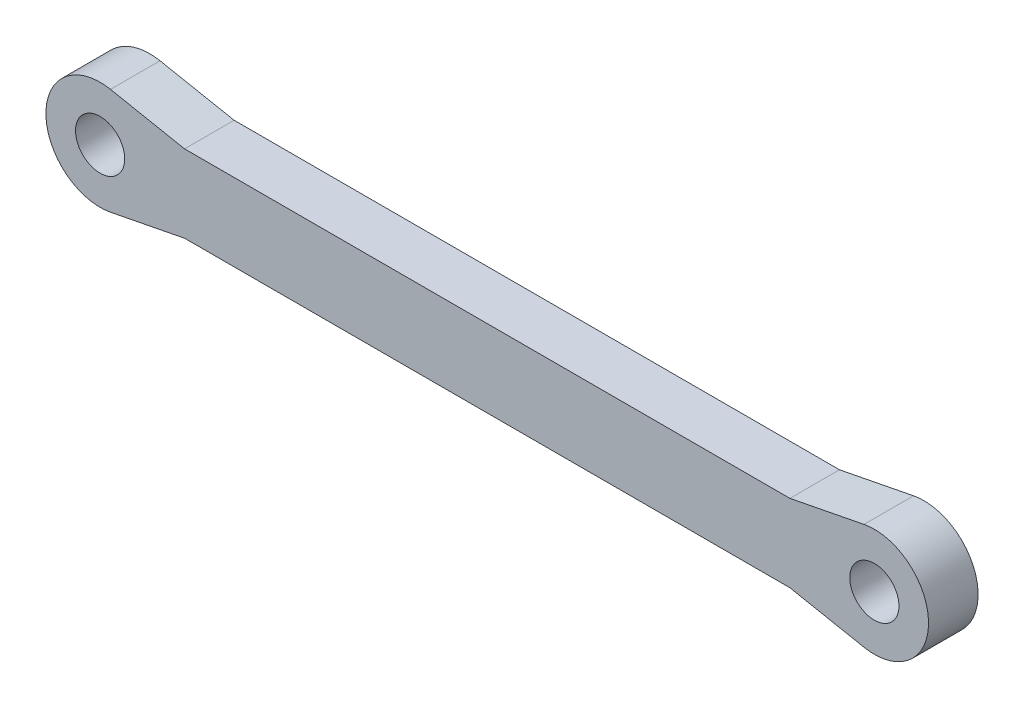
ISO-10303-21;
HEADER;
FILE_DESCRIPTION(('STEP AP214'),'2;1');
FILE_NAME('part.step','',(''),(''),'','','');
FILE_SCHEMA(('AUTOMOTIVE_DESIGN { 1 0 10303 214 1 1 1 1 }'));
ENDSEC;
DATA;
#1=APPLICATION_CONTEXT('core data for automotive mechanical design processes');
#2=APPLICATION_PROTOCOL_DEFINITION('international standard','automotive_design',2000,#1);
#3=PRODUCT_CONTEXT('',#1,'mechanical');
#4=PRODUCT('Part','Part','',(#3));
#5=PRODUCT_RELATED_PRODUCT_CATEGORY('part','',(#4));
#6=PRODUCT_DEFINITION_FORMATION('','',#4);
#7=PRODUCT_DEFINITION_CONTEXT('part definition',#1,'design');
#8=PRODUCT_DEFINITION('design','',#6,#7);
#9=PRODUCT_DEFINITION_SHAPE('','',#8);
#10=(LENGTH_UNIT() NAMED_UNIT(*) SI_UNIT(.MILLI.,.METRE.));
#11=(NAMED_UNIT(*) PLANE_ANGLE_UNIT() SI_UNIT($,.RADIAN.));
#12=(NAMED_UNIT(*) SI_UNIT($,.STERADIAN.) SOLID_ANGLE_UNIT());
#13=UNCERTAINTY_MEASURE_WITH_UNIT(LENGTH_MEASURE(1.E-05),#10,'distance_accuracy_value','');
#14=(GEOMETRIC_REPRESENTATION_CONTEXT(3) GLOBAL_UNCERTAINTY_ASSIGNED_CONTEXT((#13)) GLOBAL_UNIT_ASSIGNED_CONTEXT((#10,
#11,#12)) REPRESENTATION_CONTEXT('',''));
#15=CARTESIAN_POINT('',(0.,0.,0.));
#16=DIRECTION('',(0.,0.,1.));
#17=DIRECTION('',(1.,0.,0.));
#18=AXIS2_PLACEMENT_3D('',#15,#16,#17);
#19=CARTESIAN_POINT('',(24.9999999999999,2.22044604925031E-13,1.6));
#20=DIRECTION('',(0.,0.,1.));
#21=DIRECTION('',(1.,0.,0.));
#22=AXIS2_PLACEMENT_3D('',#19,#20,#21);
#23=PLANE('',#22);
#24=CARTESIAN_POINT('',(-25.0000000000001,2.22044604925031E-13,1.6));
#25=DIRECTION('',(0.,0.,1.));
#26=DIRECTION('',(1.,0.,0.));
#27=AXIS2_PLACEMENT_3D('',#24,#25,#26);
#28=CIRCLE('',#27,1.58750000000008);
#29=CARTESIAN_POINT('',(-23.4125000000001,2.22044604925031E-13,1.6));
#30=VERTEX_POINT('',#29);
#31=EDGE_CURVE('E134',#30,#30,#28,.T.);
#32=ORIENTED_EDGE('',*,*,#31,.F.);
#33=EDGE_LOOP('',(#32));
#34=FACE_BOUND('',#33,.T.);
#35=DIRECTION('',(0.981423427417235,-0.191854257488876,0.));
#36=VECTOR('',#35,1.);
#37=CARTESIAN_POINT('',(19.5456439426829,-2.49999999999995,1.6));
#38=LINE('',#37,#36);
#39=CARTESIAN_POINT('',(19.5456439426829,-2.49999999999995,1.6));
#40=VERTEX_POINT('',#39);
#41=CARTESIAN_POINT('',(24.3285100987898,-3.43498199596002,1.6));
#42=VERTEX_POINT('',#41);
#43=EDGE_CURVE('E145',#40,#42,#38,.T.);
#44=ORIENTED_EDGE('',*,*,#43,.T.);
#45=CARTESIAN_POINT('',(24.9999999999999,2.22044604925031E-13,1.6));
#46=DIRECTION('',(0.,0.,1.));
#47=DIRECTION('',(1.,0.,0.));
#48=AXIS2_PLACEMENT_3D('',#45,#46,#47);
#49=CIRCLE('',#48,3.49999999999974);
#50=CARTESIAN_POINT('',(24.3285100987889,3.43498199596026,1.6));
#51=VERTEX_POINT('',#50);
#52=EDGE_CURVE('E93',#42,#51,#49,.T.);
#53=ORIENTED_EDGE('',*,*,#52,.T.);
#54=DIRECTION('',(-0.981423427417235,-0.191854257488876,0.));
#55=VECTOR('',#54,1.);
#56=CARTESIAN_POINT('',(19.545643942682,2.50000000000017,1.6));
#57=LINE('',#56,#55);
#58=CARTESIAN_POINT('',(19.545643942682,2.50000000000017,1.6));
#59=VERTEX_POINT('',#58);
#60=EDGE_CURVE('E160',#51,#59,#57,.T.);
#61=ORIENTED_EDGE('',*,*,#60,.T.);
#62=DIRECTION('',(-1.,0.,0.));
#63=VECTOR('',#62,1.);
#64=CARTESIAN_POINT('',(19.545643942682,2.50000000000017,1.6));
#65=LINE('',#64,#63);
#66=CARTESIAN_POINT('',(-19.545643942682,2.50000000000017,1.6));
#67=VERTEX_POINT('',#66);
#68=EDGE_CURVE('E173',#59,#67,#65,.T.);
#69=ORIENTED_EDGE('',*,*,#68,.T.);
#70=DIRECTION('',(-0.981423427417252,0.191854257488788,0.));
#71=VECTOR('',#70,1.);
#72=CARTESIAN_POINT('',(-19.545643942682,2.50000000000017,1.6));
#73=LINE('',#72,#71);
#74=CARTESIAN_POINT('',(-24.3285100987888,3.43498199596012,1.6));
#75=VERTEX_POINT('',#74);
#76=EDGE_CURVE('E112',#67,#75,#73,.T.);
#77=ORIENTED_EDGE('',*,*,#76,.T.);
#78=CARTESIAN_POINT('',(-25.0000000000001,2.22044604925031E-13,1.6));
#79=DIRECTION('',(0.,0.,1.));
#80=DIRECTION('',(1.,0.,0.));
#81=AXIS2_PLACEMENT_3D('',#78,#79,#80);
#82=CIRCLE('',#81,3.49999999999963);
#83=CARTESIAN_POINT('',(-24.3285100987891,-3.43498199596004,1.6));
#84=VERTEX_POINT('',#83);
#85=EDGE_CURVE('E106',#75,#84,#82,.T.);
#86=ORIENTED_EDGE('',*,*,#85,.T.);
#87=DIRECTION('',(0.98142342741723,0.191854257488901,0.));
#88=VECTOR('',#87,1.);
#89=CARTESIAN_POINT('',(-19.5456439426829,-2.49999999999995,1.6));
#90=LINE('',#89,#88);
#91=CARTESIAN_POINT('',(-19.5456439426829,-2.49999999999995,1.6));
#92=VERTEX_POINT('',#91);
#93=EDGE_CURVE('E110',#84,#92,#90,.T.);
#94=ORIENTED_EDGE('',*,*,#93,.T.);
#95=DIRECTION('',(1.,0.,0.));
#96=VECTOR('',#95,1.);
#97=CARTESIAN_POINT('',(19.5456439426829,-2.49999999999995,1.6));
#98=LINE('',#97,#96);
#99=EDGE_CURVE('E50',#92,#40,#98,.T.);
#100=ORIENTED_EDGE('',*,*,#99,.T.);
#101=EDGE_LOOP('',(#44,#53,#61,#69,#77,#86,#94,#100));
#102=FACE_BOUND('',#101,.T.);
#103=CARTESIAN_POINT('',(24.9999999999999,2.22044604925031E-13,1.6));
#104=DIRECTION('',(0.,0.,1.));
#105=DIRECTION('',(1.,0.,0.));
#106=AXIS2_PLACEMENT_3D('',#103,#104,#105);
#107=CIRCLE('',#106,1.58750000000008);
#108=CARTESIAN_POINT('',(26.5875,2.22044604925031E-13,1.6));
#109=VERTEX_POINT('',#108);
#110=EDGE_CURVE('E182',#109,#109,#107,.T.);
#111=ORIENTED_EDGE('',*,*,#110,.F.);
#112=EDGE_LOOP('',(#111));
#113=FACE_BOUND('',#112,.T.);
#114=ADVANCED_FACE('F33',(#34,#102,#113),#23,.T.);
#115=CARTESIAN_POINT('',(24.9999999999999,2.22044604925031E-13,-1.6));
#116=DIRECTION('',(0.,0.,1.));
#117=DIRECTION('',(1.,0.,0.));
#118=AXIS2_PLACEMENT_3D('',#115,#116,#117);
#119=PLANE('',#118);
#120=DIRECTION('',(0.981423427417235,-0.191854257488876,0.));
#121=VECTOR('',#120,1.);
#122=CARTESIAN_POINT('',(19.5456439426829,-2.49999999999995,-1.6));
#123=LINE('',#122,#121);
#124=CARTESIAN_POINT('',(19.5456439426829,-2.49999999999995,-1.6));
#125=VERTEX_POINT('',#124);
#126=CARTESIAN_POINT('',(24.3285100987898,-3.43498199596002,-1.6));
#127=VERTEX_POINT('',#126);
#128=EDGE_CURVE('E130',#125,#127,#123,.T.);
#129=ORIENTED_EDGE('',*,*,#128,.F.);
#130=DIRECTION('',(1.,0.,0.));
#131=VECTOR('',#130,1.);
#132=CARTESIAN_POINT('',(19.5456439426829,-2.49999999999995,-1.6));
#133=LINE('',#132,#131);
#134=CARTESIAN_POINT('',(-19.5456439426829,-2.49999999999995,-1.6));
#135=VERTEX_POINT('',#134);
#136=EDGE_CURVE('E85',#135,#125,#133,.T.);
#137=ORIENTED_EDGE('',*,*,#136,.F.);
#138=DIRECTION('',(0.98142342741723,0.191854257488901,0.));
#139=VECTOR('',#138,1.);
#140=CARTESIAN_POINT('',(-19.5456439426829,-2.49999999999995,-1.6));
#141=LINE('',#140,#139);
#142=CARTESIAN_POINT('',(-24.3285100987891,-3.43498199596004,-1.6));
#143=VERTEX_POINT('',#142);
#144=EDGE_CURVE('E79',#143,#135,#141,.T.);
#145=ORIENTED_EDGE('',*,*,#144,.F.);
#146=CARTESIAN_POINT('',(-25.0000000000001,2.22044604925031E-13,-1.6));
#147=DIRECTION('',(0.,0.,1.));
#148=DIRECTION('',(1.,0.,0.));
#149=AXIS2_PLACEMENT_3D('',#146,#147,#148);
#150=CIRCLE('',#149,3.49999999999963);
#151=CARTESIAN_POINT('',(-24.3285100987888,3.43498199596012,-1.6));
#152=VERTEX_POINT('',#151);
#153=EDGE_CURVE('E120',#152,#143,#150,.T.);
#154=ORIENTED_EDGE('',*,*,#153,.F.);
#155=DIRECTION('',(-0.981423427417252,0.191854257488788,0.));
#156=VECTOR('',#155,1.);
#157=CARTESIAN_POINT('',(-19.545643942682,2.50000000000017,-1.6));
#158=LINE('',#157,#156);
#159=CARTESIAN_POINT('',(-19.545643942682,2.50000000000017,-1.6));
#160=VERTEX_POINT('',#159);
#161=EDGE_CURVE('E140',#160,#152,#158,.T.);
#162=ORIENTED_EDGE('',*,*,#161,.F.);
#163=DIRECTION('',(-1.,0.,0.));
#164=VECTOR('',#163,1.);
#165=CARTESIAN_POINT('',(19.545643942682,2.50000000000017,-1.6));
#166=LINE('',#165,#164);
#167=CARTESIAN_POINT('',(19.545643942682,2.50000000000017,-1.6));
#168=VERTEX_POINT('',#167);
#169=EDGE_CURVE('E138',#168,#160,#166,.T.);
#170=ORIENTED_EDGE('',*,*,#169,.F.);
#171=DIRECTION('',(-0.981423427417235,-0.191854257488876,0.));
#172=VECTOR('',#171,1.);
#173=CARTESIAN_POINT('',(19.545643942682,2.50000000000017,-1.6));
#174=LINE('',#173,#172);
#175=CARTESIAN_POINT('',(24.3285100987889,3.43498199596026,-1.6));
#176=VERTEX_POINT('',#175);
#177=EDGE_CURVE('E136',#176,#168,#174,.T.);
#178=ORIENTED_EDGE('',*,*,#177,.F.);
#179=CARTESIAN_POINT('',(24.9999999999999,2.22044604925031E-13,-1.6));
#180=DIRECTION('',(0.,0.,1.));
#181=DIRECTION('',(1.,0.,0.));
#182=AXIS2_PLACEMENT_3D('',#179,#180,#181);
#183=CIRCLE('',#182,3.49999999999974);
#184=EDGE_CURVE('E133',#127,#176,#183,.T.);
#185=ORIENTED_EDGE('',*,*,#184,.F.);
#186=EDGE_LOOP('',(#129,#137,#145,#154,#162,#170,#178,#185));
#187=FACE_BOUND('',#186,.T.);
#188=CARTESIAN_POINT('',(-25.0000000000001,2.22044604925031E-13,-1.6));
#189=DIRECTION('',(0.,0.,1.));
#190=DIRECTION('',(1.,0.,0.));
#191=AXIS2_PLACEMENT_3D('',#188,#189,#190);
#192=CIRCLE('',#191,1.58750000000008);
#193=CARTESIAN_POINT('',(-23.4125000000001,2.22044604925031E-13,-1.6));
#194=VERTEX_POINT('',#193);
#195=EDGE_CURVE('E179',#194,#194,#192,.T.);
#196=ORIENTED_EDGE('',*,*,#195,.T.);
#197=EDGE_LOOP('',(#196));
#198=FACE_BOUND('',#197,.T.);
#199=CARTESIAN_POINT('',(24.9999999999999,2.22044604925031E-13,-1.6));
#200=DIRECTION('',(0.,0.,1.));
#201=DIRECTION('',(1.,0.,0.));
#202=AXIS2_PLACEMENT_3D('',#199,#200,#201);
#203=CIRCLE('',#202,1.58750000000008);
#204=CARTESIAN_POINT('',(26.5875,2.22044604925031E-13,-1.6));
#205=VERTEX_POINT('',#204);
#206=EDGE_CURVE('E185',#205,#205,#203,.T.);
#207=ORIENTED_EDGE('',*,*,#206,.T.);
#208=EDGE_LOOP('',(#207));
#209=FACE_BOUND('',#208,.T.);
#210=ADVANCED_FACE('F164',(#187,#198,#209),#119,.F.);
#211=CARTESIAN_POINT('',(19.5456439426829,-2.49999999999995,1.6));
#212=DIRECTION('',(0.191854257488876,0.981423427417235,0.));
#213=DIRECTION('',(-0.981423427417235,0.191854257488876,0.));
#214=AXIS2_PLACEMENT_3D('',#211,#212,#213);
#215=PLANE('',#214);
#216=ORIENTED_EDGE('',*,*,#128,.T.);
#217=DIRECTION('',(0.,0.,-1.));
#218=VECTOR('',#217,1.);
#219=CARTESIAN_POINT('',(24.3285100987898,-3.43498199596002,1.6));
#220=LINE('',#219,#218);
#221=EDGE_CURVE('E11',#42,#127,#220,.T.);
#222=ORIENTED_EDGE('',*,*,#221,.F.);
#223=ORIENTED_EDGE('',*,*,#43,.F.);
#224=DIRECTION('',(0.,0.,-1.));
#225=VECTOR('',#224,1.);
#226=CARTESIAN_POINT('',(19.5456439426829,-2.49999999999995,1.6));
#227=LINE('',#226,#225);
#228=EDGE_CURVE('E126',#40,#125,#227,.T.);
#229=ORIENTED_EDGE('',*,*,#228,.T.);
#230=EDGE_LOOP('',(#216,#222,#223,#229));
#231=FACE_BOUND('',#230,.T.);
#232=ADVANCED_FACE('F35',(#231),#215,.F.);
#233=CARTESIAN_POINT('',(24.9999999999999,2.22044604925031E-13,1.6));
#234=DIRECTION('',(0.,0.,-1.));
#235=DIRECTION('',(-1.,0.,0.));
#236=AXIS2_PLACEMENT_3D('',#233,#234,#235);
#237=CYLINDRICAL_SURFACE('',#236,3.49999999999974);
#238=ORIENTED_EDGE('',*,*,#184,.T.);
#239=DIRECTION('',(0.,0.,-1.));
#240=VECTOR('',#239,1.);
#241=CARTESIAN_POINT('',(24.3285100987889,3.43498199596026,1.6));
#242=LINE('',#241,#240);
#243=EDGE_CURVE('E42',#51,#176,#242,.T.);
#244=ORIENTED_EDGE('',*,*,#243,.F.);
#245=ORIENTED_EDGE('',*,*,#52,.F.);
#246=ORIENTED_EDGE('',*,*,#221,.T.);
#247=EDGE_LOOP('',(#238,#244,#245,#246));
#248=FACE_BOUND('',#247,.T.);
#249=ADVANCED_FACE('F217',(#248),#237,.T.);
#250=CARTESIAN_POINT('',(19.545643942682,2.50000000000017,1.6));
#251=DIRECTION('',(0.191854257488876,-0.981423427417235,0.));
#252=DIRECTION('',(0.981423427417235,0.191854257488876,0.));
#253=AXIS2_PLACEMENT_3D('',#250,#251,#252);
#254=PLANE('',#253);
#255=ORIENTED_EDGE('',*,*,#177,.T.);
#256=DIRECTION('',(0.,0.,-1.));
#257=VECTOR('',#256,1.);
#258=CARTESIAN_POINT('',(19.545643942682,2.50000000000017,1.6));
#259=LINE('',#258,#257);
#260=EDGE_CURVE('E152',#59,#168,#259,.T.);
#261=ORIENTED_EDGE('',*,*,#260,.F.);
#262=ORIENTED_EDGE('',*,*,#60,.F.);
#263=ORIENTED_EDGE('',*,*,#243,.T.);
#264=EDGE_LOOP('',(#255,#261,#262,#263));
#265=FACE_BOUND('',#264,.T.);
#266=ADVANCED_FACE('F158',(#265),#254,.F.);
#267=CARTESIAN_POINT('',(19.545643942682,2.50000000000017,1.6));
#268=DIRECTION('',(0.,-1.,0.));
#269=DIRECTION('',(0.,0.,-1.));
#270=AXIS2_PLACEMENT_3D('',#267,#268,#269);
#271=PLANE('',#270);
#272=ORIENTED_EDGE('',*,*,#169,.T.);
#273=DIRECTION('',(0.,0.,-1.));
#274=VECTOR('',#273,1.);
#275=CARTESIAN_POINT('',(-19.545643942682,2.50000000000017,1.6));
#276=LINE('',#275,#274);
#277=EDGE_CURVE('E149',#67,#160,#276,.T.);
#278=ORIENTED_EDGE('',*,*,#277,.F.);
#279=ORIENTED_EDGE('',*,*,#68,.F.);
#280=ORIENTED_EDGE('',*,*,#260,.T.);
#281=EDGE_LOOP('',(#272,#278,#279,#280));
#282=FACE_BOUND('',#281,.T.);
#283=ADVANCED_FACE('F169',(#282),#271,.F.);
#284=CARTESIAN_POINT('',(-19.545643942682,2.50000000000017,1.6));
#285=DIRECTION('',(-0.191854257488788,-0.981423427417252,0.));
#286=DIRECTION('',(0.981423427417252,-0.191854257488788,0.));
#287=AXIS2_PLACEMENT_3D('',#284,#285,#286);
#288=PLANE('',#287);
#289=ORIENTED_EDGE('',*,*,#161,.T.);
#290=DIRECTION('',(0.,0.,-1.));
#291=VECTOR('',#290,1.);
#292=CARTESIAN_POINT('',(-24.3285100987888,3.43498199596012,1.6));
#293=LINE('',#292,#291);
#294=EDGE_CURVE('E121',#75,#152,#293,.T.);
#295=ORIENTED_EDGE('',*,*,#294,.F.);
#296=ORIENTED_EDGE('',*,*,#76,.F.);
#297=ORIENTED_EDGE('',*,*,#277,.T.);
#298=EDGE_LOOP('',(#289,#295,#296,#297));
#299=FACE_BOUND('',#298,.T.);
#300=ADVANCED_FACE('F172',(#299),#288,.F.);
#301=CARTESIAN_POINT('',(-25.0000000000001,2.22044604925031E-13,1.6));
#302=DIRECTION('',(0.,0.,-1.));
#303=DIRECTION('',(-1.,0.,0.));
#304=AXIS2_PLACEMENT_3D('',#301,#302,#303);
#305=CYLINDRICAL_SURFACE('',#304,3.49999999999963);
#306=ORIENTED_EDGE('',*,*,#153,.T.);
#307=DIRECTION('',(0.,0.,-1.));
#308=VECTOR('',#307,1.);
#309=CARTESIAN_POINT('',(-24.3285100987891,-3.43498199596004,1.6));
#310=LINE('',#309,#308);
#311=EDGE_CURVE('E117',#84,#143,#310,.T.);
#312=ORIENTED_EDGE('',*,*,#311,.F.);
#313=ORIENTED_EDGE('',*,*,#85,.F.);
#314=ORIENTED_EDGE('',*,*,#294,.T.);
#315=EDGE_LOOP('',(#306,#312,#313,#314));
#316=FACE_BOUND('',#315,.T.);
#317=ADVANCED_FACE('F118',(#316),#305,.T.);
#318=CARTESIAN_POINT('',(-19.5456439426829,-2.49999999999995,1.6));
#319=DIRECTION('',(-0.191854257488901,0.98142342741723,0.));
#320=DIRECTION('',(-0.98142342741723,-0.191854257488901,0.));
#321=AXIS2_PLACEMENT_3D('',#318,#319,#320);
#322=PLANE('',#321);
#323=ORIENTED_EDGE('',*,*,#144,.T.);
#324=DIRECTION('',(0.,0.,-1.));
#325=VECTOR('',#324,1.);
#326=CARTESIAN_POINT('',(-19.5456439426829,-2.49999999999995,1.6));
#327=LINE('',#326,#325);
#328=EDGE_CURVE('E122',#92,#135,#327,.T.);
#329=ORIENTED_EDGE('',*,*,#328,.F.);
#330=ORIENTED_EDGE('',*,*,#93,.F.);
#331=ORIENTED_EDGE('',*,*,#311,.T.);
#332=EDGE_LOOP('',(#323,#329,#330,#331));
#333=FACE_BOUND('',#332,.T.);
#334=ADVANCED_FACE('F124',(#333),#322,.F.);
#335=CARTESIAN_POINT('',(19.5456439426829,-2.49999999999995,1.6));
#336=DIRECTION('',(0.,1.,0.));
#337=DIRECTION('',(0.,0.,1.));
#338=AXIS2_PLACEMENT_3D('',#335,#336,#337);
#339=PLANE('',#338);
#340=ORIENTED_EDGE('',*,*,#136,.T.);
#341=ORIENTED_EDGE('',*,*,#228,.F.);
#342=ORIENTED_EDGE('',*,*,#99,.F.);
#343=ORIENTED_EDGE('',*,*,#328,.T.);
#344=EDGE_LOOP('',(#340,#341,#342,#343));
#345=FACE_BOUND('',#344,.T.);
#346=ADVANCED_FACE('F205',(#345),#339,.F.);
#347=CARTESIAN_POINT('',(-25.0000000000001,2.22044604925031E-13,1.6));
#348=DIRECTION('',(0.,0.,-1.));
#349=DIRECTION('',(-1.,0.,0.));
#350=AXIS2_PLACEMENT_3D('',#347,#348,#349);
#351=CYLINDRICAL_SURFACE('',#350,1.58750000000008);
#352=ORIENTED_EDGE('',*,*,#31,.T.);
#353=EDGE_LOOP('',(#352));
#354=FACE_BOUND('',#353,.T.);
#355=ORIENTED_EDGE('',*,*,#195,.F.);
#356=EDGE_LOOP('',(#355));
#357=FACE_BOUND('',#356,.T.);
#358=ADVANCED_FACE('F202',(#354,#357),#351,.F.);
#359=CARTESIAN_POINT('',(24.9999999999999,2.22044604925031E-13,1.6));
#360=DIRECTION('',(0.,0.,-1.));
#361=DIRECTION('',(-1.,0.,0.));
#362=AXIS2_PLACEMENT_3D('',#359,#360,#361);
#363=CYLINDRICAL_SURFACE('',#362,1.58750000000008);
#364=ORIENTED_EDGE('',*,*,#110,.T.);
#365=EDGE_LOOP('',(#364));
#366=FACE_BOUND('',#365,.T.);
#367=ORIENTED_EDGE('',*,*,#206,.F.);
#368=EDGE_LOOP('',(#367));
#369=FACE_BOUND('',#368,.T.);
#370=ADVANCED_FACE('F191',(#366,#369),#363,.F.);
#371=CLOSED_SHELL('',(#114,#210,#232,#249,#266,#283,#300,#317,#334,#346,#358,#370));
#372=MANIFOLD_SOLID_BREP('B2',#371);
#373=ADVANCED_BREP_SHAPE_REPRESENTATION('',(#18,#372),#14);
#374=SHAPE_DEFINITION_REPRESENTATION(#9,#373);
ENDSEC;
END-ISO-10303-21;
